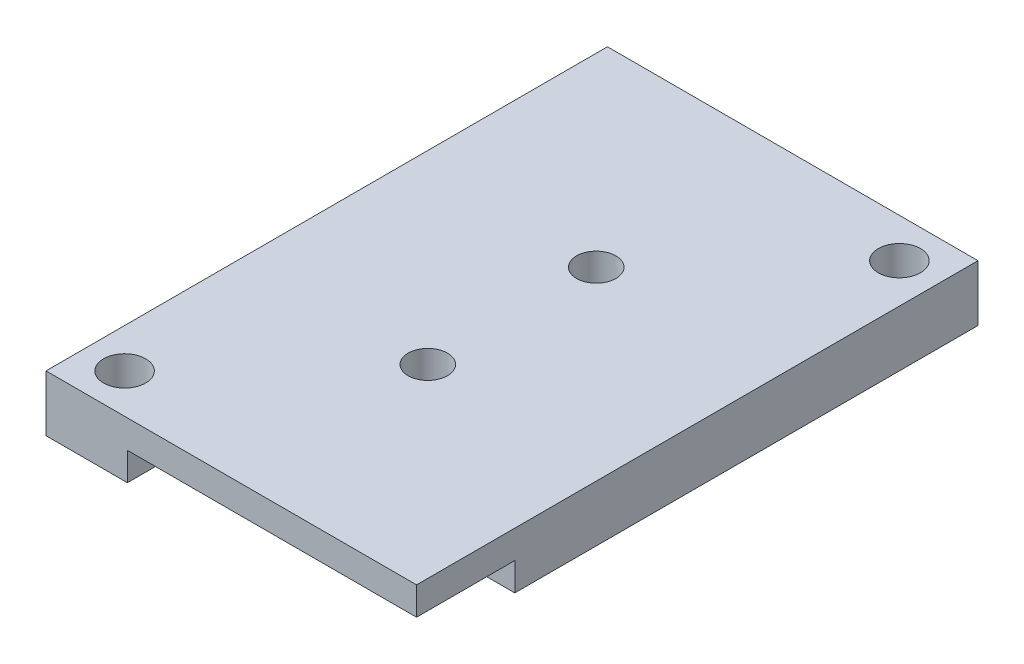
ISO-10303-21;
HEADER;
FILE_DESCRIPTION(('STEP AP214'),'2;1');
FILE_NAME('part.step','',(''),(''),'','','');
FILE_SCHEMA(('AUTOMOTIVE_DESIGN { 1 0 10303 214 1 1 1 1 }'));
ENDSEC;
DATA;
#1=APPLICATION_CONTEXT('core data for automotive mechanical design processes');
#2=APPLICATION_PROTOCOL_DEFINITION('international standard','automotive_design',2000,#1);
#3=PRODUCT_CONTEXT('',#1,'mechanical');
#4=PRODUCT('Part','Part','',(#3));
#5=PRODUCT_RELATED_PRODUCT_CATEGORY('part','',(#4));
#6=PRODUCT_DEFINITION_FORMATION('','',#4);
#7=PRODUCT_DEFINITION_CONTEXT('part definition',#1,'design');
#8=PRODUCT_DEFINITION('design','',#6,#7);
#9=PRODUCT_DEFINITION_SHAPE('','',#8);
#10=(LENGTH_UNIT() NAMED_UNIT(*) SI_UNIT(.MILLI.,.METRE.));
#11=(NAMED_UNIT(*) PLANE_ANGLE_UNIT() SI_UNIT($,.RADIAN.));
#12=(NAMED_UNIT(*) SI_UNIT($,.STERADIAN.) SOLID_ANGLE_UNIT());
#13=UNCERTAINTY_MEASURE_WITH_UNIT(LENGTH_MEASURE(1.E-05),#10,'distance_accuracy_value','');
#14=(GEOMETRIC_REPRESENTATION_CONTEXT(3) GLOBAL_UNCERTAINTY_ASSIGNED_CONTEXT((#13)) GLOBAL_UNIT_ASSIGNED_CONTEXT((#10,
#11,#12)) REPRESENTATION_CONTEXT('',''));
#15=CARTESIAN_POINT('',(0.,0.,0.));
#16=DIRECTION('',(0.,0.,1.));
#17=DIRECTION('',(1.,0.,0.));
#18=AXIS2_PLACEMENT_3D('',#15,#16,#17);
#19=CARTESIAN_POINT('',(0.,0.,0.));
#20=DIRECTION('',(0.,-1.,0.));
#21=DIRECTION('',(0.,0.,-1.));
#22=AXIS2_PLACEMENT_3D('',#19,#20,#21);
#23=PLANE('',#22);
#24=CARTESIAN_POINT('',(5.2,0.,-8.6));
#25=DIRECTION('',(0.,1.,0.));
#26=DIRECTION('',(0.,0.,1.));
#27=AXIS2_PLACEMENT_3D('',#24,#25,#26);
#28=CIRCLE('',#27,0.75);
#29=CARTESIAN_POINT('',(5.2,0.,-7.85));
#30=VERTEX_POINT('',#29);
#31=EDGE_CURVE('E239',#30,#30,#28,.T.);
#32=ORIENTED_EDGE('',*,*,#31,.T.);
#33=EDGE_LOOP('',(#32));
#34=FACE_BOUND('',#33,.T.);
#35=DIRECTION('',(-1.,0.,0.));
#36=VECTOR('',#35,1.);
#37=CARTESIAN_POINT('',(0.,0.,-6.5));
#38=LINE('',#37,#36);
#39=CARTESIAN_POINT('',(3.7,0.,-6.5));
#40=VERTEX_POINT('',#39);
#41=CARTESIAN_POINT('',(2.5,0.,-6.5));
#42=VERTEX_POINT('',#41);
#43=EDGE_CURVE('E195',#40,#42,#38,.T.);
#44=ORIENTED_EDGE('',*,*,#43,.F.);
#45=DIRECTION('',(0.,0.,-1.));
#46=VECTOR('',#45,1.);
#47=CARTESIAN_POINT('',(3.7,0.,0.));
#48=LINE('',#47,#46);
#49=CARTESIAN_POINT('',(3.7,0.,-10.));
#50=VERTEX_POINT('',#49);
#51=EDGE_CURVE('E202',#40,#50,#48,.T.);
#52=ORIENTED_EDGE('',*,*,#51,.T.);
#53=DIRECTION('',(1.,0.,0.));
#54=VECTOR('',#53,1.);
#55=CARTESIAN_POINT('',(-6.6,0.,-10.));
#56=LINE('',#55,#54);
#57=CARTESIAN_POINT('',(6.6,0.,-10.));
#58=VERTEX_POINT('',#57);
#59=EDGE_CURVE('E235',#50,#58,#56,.T.);
#60=ORIENTED_EDGE('',*,*,#59,.T.);
#61=DIRECTION('',(0.,0.,1.));
#62=VECTOR('',#61,1.);
#63=CARTESIAN_POINT('',(6.6,0.,-10.));
#64=LINE('',#63,#62);
#65=CARTESIAN_POINT('',(6.6,0.,6.5));
#66=VERTEX_POINT('',#65);
#67=EDGE_CURVE('E253',#58,#66,#64,.T.);
#68=ORIENTED_EDGE('',*,*,#67,.T.);
#69=DIRECTION('',(1.,0.,0.));
#70=VECTOR('',#69,1.);
#71=CARTESIAN_POINT('',(0.,0.,6.5));
#72=LINE('',#71,#70);
#73=CARTESIAN_POINT('',(2.5,0.,6.5));
#74=VERTEX_POINT('',#73);
#75=EDGE_CURVE('E226',#74,#66,#72,.T.);
#76=ORIENTED_EDGE('',*,*,#75,.F.);
#77=DIRECTION('',(0.,0.,-1.));
#78=VECTOR('',#77,1.);
#79=CARTESIAN_POINT('',(2.5,0.,0.));
#80=LINE('',#79,#78);
#81=EDGE_CURVE('E52',#74,#42,#80,.T.);
#82=ORIENTED_EDGE('',*,*,#81,.T.);
#83=EDGE_LOOP('',(#44,#52,#60,#68,#76,#82));
#84=FACE_BOUND('',#83,.T.);
#85=ADVANCED_FACE('F35',(#34,#84),#23,.T.);
#86=CARTESIAN_POINT('',(-6.6,2.,-10.));
#87=DIRECTION('',(0.,0.,-1.));
#88=DIRECTION('',(-1.,0.,0.));
#89=AXIS2_PLACEMENT_3D('',#86,#87,#88);
#90=PLANE('',#89);
#91=DIRECTION('',(-1.,0.,0.));
#92=VECTOR('',#91,1.);
#93=CARTESIAN_POINT('',(0.,1.,-10.));
#94=LINE('',#93,#92);
#95=CARTESIAN_POINT('',(3.7,1.,-10.));
#96=VERTEX_POINT('',#95);
#97=CARTESIAN_POINT('',(-6.6,1.,-10.));
#98=VERTEX_POINT('',#97);
#99=EDGE_CURVE('E194',#96,#98,#94,.T.);
#100=ORIENTED_EDGE('',*,*,#99,.T.);
#101=DIRECTION('',(0.,-1.,0.));
#102=VECTOR('',#101,1.);
#103=CARTESIAN_POINT('',(-6.6,2.,-10.));
#104=LINE('',#103,#102);
#105=CARTESIAN_POINT('',(-6.6,2.,-10.));
#106=VERTEX_POINT('',#105);
#107=EDGE_CURVE('E11',#106,#98,#104,.T.);
#108=ORIENTED_EDGE('',*,*,#107,.F.);
#109=DIRECTION('',(1.,0.,0.));
#110=VECTOR('',#109,1.);
#111=CARTESIAN_POINT('',(-6.6,2.,-10.));
#112=LINE('',#111,#110);
#113=CARTESIAN_POINT('',(6.6,2.,-10.));
#114=VERTEX_POINT('',#113);
#115=EDGE_CURVE('E244',#106,#114,#112,.T.);
#116=ORIENTED_EDGE('',*,*,#115,.T.);
#117=DIRECTION('',(0.,-1.,0.));
#118=VECTOR('',#117,1.);
#119=CARTESIAN_POINT('',(6.6,2.,-10.));
#120=LINE('',#119,#118);
#121=EDGE_CURVE('E84',#114,#58,#120,.T.);
#122=ORIENTED_EDGE('',*,*,#121,.T.);
#123=ORIENTED_EDGE('',*,*,#59,.F.);
#124=DIRECTION('',(0.,-1.,0.));
#125=VECTOR('',#124,1.);
#126=CARTESIAN_POINT('',(3.7,1.,-10.));
#127=LINE('',#126,#125);
#128=EDGE_CURVE('E185',#96,#50,#127,.T.);
#129=ORIENTED_EDGE('',*,*,#128,.F.);
#130=EDGE_LOOP('',(#100,#108,#116,#122,#123,#129));
#131=FACE_BOUND('',#130,.T.);
#132=ADVANCED_FACE('F37',(#131),#90,.T.);
#133=CARTESIAN_POINT('',(-6.6,2.,-10.));
#134=DIRECTION('',(1.,0.,0.));
#135=DIRECTION('',(0.,0.,-1.));
#136=AXIS2_PLACEMENT_3D('',#133,#134,#135);
#137=PLANE('',#136);
#138=ORIENTED_EDGE('',*,*,#107,.T.);
#139=DIRECTION('',(0.,0.,-1.));
#140=VECTOR('',#139,1.);
#141=CARTESIAN_POINT('',(-6.6,1.,0.));
#142=LINE('',#141,#140);
#143=CARTESIAN_POINT('',(-6.6,1.,-6.5));
#144=VERTEX_POINT('',#143);
#145=EDGE_CURVE('E197',#144,#98,#142,.T.);
#146=ORIENTED_EDGE('',*,*,#145,.F.);
#147=DIRECTION('',(0.,-1.,0.));
#148=VECTOR('',#147,1.);
#149=CARTESIAN_POINT('',(-6.6,1.,-6.5));
#150=LINE('',#149,#148);
#151=CARTESIAN_POINT('',(-6.6,0.,-6.5));
#152=VERTEX_POINT('',#151);
#153=EDGE_CURVE('E210',#144,#152,#150,.T.);
#154=ORIENTED_EDGE('',*,*,#153,.T.);
#155=DIRECTION('',(0.,0.,1.));
#156=VECTOR('',#155,1.);
#157=CARTESIAN_POINT('',(-6.6,0.,-10.));
#158=LINE('',#157,#156);
#159=CARTESIAN_POINT('',(-6.6,0.,10.));
#160=VERTEX_POINT('',#159);
#161=EDGE_CURVE('E76',#152,#160,#158,.T.);
#162=ORIENTED_EDGE('',*,*,#161,.T.);
#163=DIRECTION('',(0.,-1.,0.));
#164=VECTOR('',#163,1.);
#165=CARTESIAN_POINT('',(-6.6,2.,10.));
#166=LINE('',#165,#164);
#167=CARTESIAN_POINT('',(-6.6,2.,10.));
#168=VERTEX_POINT('',#167);
#169=EDGE_CURVE('E44',#168,#160,#166,.T.);
#170=ORIENTED_EDGE('',*,*,#169,.F.);
#171=DIRECTION('',(0.,0.,1.));
#172=VECTOR('',#171,1.);
#173=CARTESIAN_POINT('',(-6.6,2.,-10.));
#174=LINE('',#173,#172);
#175=EDGE_CURVE('E250',#106,#168,#174,.T.);
#176=ORIENTED_EDGE('',*,*,#175,.F.);
#177=EDGE_LOOP('',(#138,#146,#154,#162,#170,#176));
#178=FACE_BOUND('',#177,.T.);
#179=ADVANCED_FACE('F299',(#178),#137,.F.);
#180=CARTESIAN_POINT('',(-6.6,2.,10.));
#181=DIRECTION('',(0.,0.,-1.));
#182=DIRECTION('',(-1.,0.,0.));
#183=AXIS2_PLACEMENT_3D('',#180,#181,#182);
#184=PLANE('',#183);
#185=DIRECTION('',(0.,-1.,0.));
#186=VECTOR('',#185,1.);
#187=CARTESIAN_POINT('',(-3.7,1.,10.));
#188=LINE('',#187,#186);
#189=CARTESIAN_POINT('',(-3.7,1.,10.));
#190=VERTEX_POINT('',#189);
#191=CARTESIAN_POINT('',(-3.7,0.,10.));
#192=VERTEX_POINT('',#191);
#193=EDGE_CURVE('E206',#190,#192,#188,.T.);
#194=ORIENTED_EDGE('',*,*,#193,.F.);
#195=DIRECTION('',(1.,0.,0.));
#196=VECTOR('',#195,1.);
#197=CARTESIAN_POINT('',(0.,1.,10.));
#198=LINE('',#197,#196);
#199=CARTESIAN_POINT('',(6.6,1.,10.));
#200=VERTEX_POINT('',#199);
#201=EDGE_CURVE('E216',#190,#200,#198,.T.);
#202=ORIENTED_EDGE('',*,*,#201,.T.);
#203=DIRECTION('',(0.,-1.,0.));
#204=VECTOR('',#203,1.);
#205=CARTESIAN_POINT('',(6.6,2.,10.));
#206=LINE('',#205,#204);
#207=CARTESIAN_POINT('',(6.6,2.,10.));
#208=VERTEX_POINT('',#207);
#209=EDGE_CURVE('E261',#208,#200,#206,.T.);
#210=ORIENTED_EDGE('',*,*,#209,.F.);
#211=DIRECTION('',(1.,0.,0.));
#212=VECTOR('',#211,1.);
#213=CARTESIAN_POINT('',(-6.6,2.,10.));
#214=LINE('',#213,#212);
#215=EDGE_CURVE('E248',#168,#208,#214,.T.);
#216=ORIENTED_EDGE('',*,*,#215,.F.);
#217=ORIENTED_EDGE('',*,*,#169,.T.);
#218=DIRECTION('',(1.,0.,0.));
#219=VECTOR('',#218,1.);
#220=CARTESIAN_POINT('',(-6.6,0.,10.));
#221=LINE('',#220,#219);
#222=EDGE_CURVE('E256',#160,#192,#221,.T.);
#223=ORIENTED_EDGE('',*,*,#222,.T.);
#224=EDGE_LOOP('',(#194,#202,#210,#216,#217,#223));
#225=FACE_BOUND('',#224,.T.);
#226=ADVANCED_FACE('F305',(#225),#184,.F.);
#227=CARTESIAN_POINT('',(6.6,2.,-10.));
#228=DIRECTION('',(1.,0.,0.));
#229=DIRECTION('',(0.,0.,-1.));
#230=AXIS2_PLACEMENT_3D('',#227,#228,#229);
#231=PLANE('',#230);
#232=DIRECTION('',(0.,0.,1.));
#233=VECTOR('',#232,1.);
#234=CARTESIAN_POINT('',(6.6,1.,0.));
#235=LINE('',#234,#233);
#236=CARTESIAN_POINT('',(6.6,1.,6.5));
#237=VERTEX_POINT('',#236);
#238=EDGE_CURVE('E166',#237,#200,#235,.T.);
#239=ORIENTED_EDGE('',*,*,#238,.F.);
#240=DIRECTION('',(0.,-1.,0.));
#241=VECTOR('',#240,1.);
#242=CARTESIAN_POINT('',(6.6,1.,6.5));
#243=LINE('',#242,#241);
#244=EDGE_CURVE('E162',#237,#66,#243,.T.);
#245=ORIENTED_EDGE('',*,*,#244,.T.);
#246=ORIENTED_EDGE('',*,*,#67,.F.);
#247=ORIENTED_EDGE('',*,*,#121,.F.);
#248=DIRECTION('',(0.,0.,1.));
#249=VECTOR('',#248,1.);
#250=CARTESIAN_POINT('',(6.6,2.,-10.));
#251=LINE('',#250,#249);
#252=EDGE_CURVE('E246',#114,#208,#251,.T.);
#253=ORIENTED_EDGE('',*,*,#252,.T.);
#254=ORIENTED_EDGE('',*,*,#209,.T.);
#255=EDGE_LOOP('',(#239,#245,#246,#247,#253,#254));
#256=FACE_BOUND('',#255,.T.);
#257=ADVANCED_FACE('F283',(#256),#231,.T.);
#258=CARTESIAN_POINT('',(0.,2.,0.));
#259=DIRECTION('',(0.,-1.,0.));
#260=DIRECTION('',(0.,0.,-1.));
#261=AXIS2_PLACEMENT_3D('',#258,#259,#260);
#262=PLANE('',#261);
#263=CARTESIAN_POINT('',(0.,2.,-3.));
#264=DIRECTION('',(0.,1.,0.));
#265=DIRECTION('',(0.,0.,1.));
#266=AXIS2_PLACEMENT_3D('',#263,#264,#265);
#267=CIRCLE('',#266,0.7);
#268=CARTESIAN_POINT('',(0.,2.,-2.3));
#269=VERTEX_POINT('',#268);
#270=EDGE_CURVE('E266',#269,#269,#267,.T.);
#271=ORIENTED_EDGE('',*,*,#270,.F.);
#272=EDGE_LOOP('',(#271));
#273=FACE_BOUND('',#272,.T.);
#274=CARTESIAN_POINT('',(0.,2.,3.));
#275=DIRECTION('',(0.,1.,0.));
#276=DIRECTION('',(0.,0.,1.));
#277=AXIS2_PLACEMENT_3D('',#274,#275,#276);
#278=CIRCLE('',#277,0.7);
#279=CARTESIAN_POINT('',(0.,2.,3.7));
#280=VERTEX_POINT('',#279);
#281=EDGE_CURVE('E182',#280,#280,#278,.T.);
#282=ORIENTED_EDGE('',*,*,#281,.F.);
#283=EDGE_LOOP('',(#282));
#284=FACE_BOUND('',#283,.T.);
#285=CARTESIAN_POINT('',(-5.2,2.,8.6));
#286=DIRECTION('',(0.,1.,0.));
#287=DIRECTION('',(0.,0.,1.));
#288=AXIS2_PLACEMENT_3D('',#285,#286,#287);
#289=CIRCLE('',#288,0.75);
#290=CARTESIAN_POINT('',(-5.2,2.,9.35));
#291=VERTEX_POINT('',#290);
#292=EDGE_CURVE('E232',#291,#291,#289,.T.);
#293=ORIENTED_EDGE('',*,*,#292,.F.);
#294=EDGE_LOOP('',(#293));
#295=FACE_BOUND('',#294,.T.);
#296=CARTESIAN_POINT('',(5.2,2.,-8.6));
#297=DIRECTION('',(0.,1.,0.));
#298=DIRECTION('',(0.,0.,1.));
#299=AXIS2_PLACEMENT_3D('',#296,#297,#298);
#300=CIRCLE('',#299,0.75);
#301=CARTESIAN_POINT('',(5.2,2.,-7.85));
#302=VERTEX_POINT('',#301);
#303=EDGE_CURVE('E155',#302,#302,#300,.T.);
#304=ORIENTED_EDGE('',*,*,#303,.F.);
#305=EDGE_LOOP('',(#304));
#306=FACE_BOUND('',#305,.T.);
#307=ORIENTED_EDGE('',*,*,#115,.F.);
#308=ORIENTED_EDGE('',*,*,#175,.T.);
#309=ORIENTED_EDGE('',*,*,#215,.T.);
#310=ORIENTED_EDGE('',*,*,#252,.F.);
#311=EDGE_LOOP('',(#307,#308,#309,#310));
#312=FACE_BOUND('',#311,.T.);
#313=ADVANCED_FACE('F279',(#273,#284,#295,#306,#312),#262,.F.);
#314=CARTESIAN_POINT('',(-2.5,0.,-6.5));
#315=VERTEX_POINT('',#314);
#316=EDGE_CURVE('E205',#315,#152,#38,.T.);
#317=ORIENTED_EDGE('',*,*,#316,.F.);
#318=DIRECTION('',(0.,0.,-1.));
#319=VECTOR('',#318,1.);
#320=CARTESIAN_POINT('',(-2.5,0.,0.));
#321=LINE('',#320,#319);
#322=CARTESIAN_POINT('',(-2.5,0.,6.5));
#323=VERTEX_POINT('',#322);
#324=EDGE_CURVE('E175',#323,#315,#321,.T.);
#325=ORIENTED_EDGE('',*,*,#324,.F.);
#326=CARTESIAN_POINT('',(-3.7,0.,6.5));
#327=VERTEX_POINT('',#326);
#328=EDGE_CURVE('E217',#327,#323,#72,.T.);
#329=ORIENTED_EDGE('',*,*,#328,.F.);
#330=DIRECTION('',(0.,0.,1.));
#331=VECTOR('',#330,1.);
#332=CARTESIAN_POINT('',(-3.7,0.,0.));
#333=LINE('',#332,#331);
#334=EDGE_CURVE('E223',#327,#192,#333,.T.);
#335=ORIENTED_EDGE('',*,*,#334,.T.);
#336=ORIENTED_EDGE('',*,*,#222,.F.);
#337=ORIENTED_EDGE('',*,*,#161,.F.);
#338=EDGE_LOOP('',(#317,#325,#329,#335,#336,#337));
#339=FACE_BOUND('',#338,.T.);
#340=CARTESIAN_POINT('',(-5.2,0.,8.6));
#341=DIRECTION('',(0.,1.,0.));
#342=DIRECTION('',(0.,0.,1.));
#343=AXIS2_PLACEMENT_3D('',#340,#341,#342);
#344=CIRCLE('',#343,0.75);
#345=CARTESIAN_POINT('',(-5.2,0.,9.35));
#346=VERTEX_POINT('',#345);
#347=EDGE_CURVE('E236',#346,#346,#344,.T.);
#348=ORIENTED_EDGE('',*,*,#347,.T.);
#349=EDGE_LOOP('',(#348));
#350=FACE_BOUND('',#349,.T.);
#351=ADVANCED_FACE('F282',(#339,#350),#23,.T.);
#352=CARTESIAN_POINT('',(5.2,2.,-8.6));
#353=DIRECTION('',(0.,-1.,0.));
#354=DIRECTION('',(0.,0.,-1.));
#355=AXIS2_PLACEMENT_3D('',#352,#353,#354);
#356=CYLINDRICAL_SURFACE('',#355,0.75);
#357=ORIENTED_EDGE('',*,*,#303,.T.);
#358=EDGE_LOOP('',(#357));
#359=FACE_BOUND('',#358,.T.);
#360=ORIENTED_EDGE('',*,*,#31,.F.);
#361=EDGE_LOOP('',(#360));
#362=FACE_BOUND('',#361,.T.);
#363=ADVANCED_FACE('F339',(#359,#362),#356,.F.);
#364=CARTESIAN_POINT('',(-5.2,2.,8.6));
#365=DIRECTION('',(0.,-1.,0.));
#366=DIRECTION('',(0.,0.,-1.));
#367=AXIS2_PLACEMENT_3D('',#364,#365,#366);
#368=CYLINDRICAL_SURFACE('',#367,0.75);
#369=ORIENTED_EDGE('',*,*,#292,.T.);
#370=EDGE_LOOP('',(#369));
#371=FACE_BOUND('',#370,.T.);
#372=ORIENTED_EDGE('',*,*,#347,.F.);
#373=EDGE_LOOP('',(#372));
#374=FACE_BOUND('',#373,.T.);
#375=ADVANCED_FACE('F328',(#371,#374),#368,.F.);
#376=CARTESIAN_POINT('',(0.,1.,0.));
#377=DIRECTION('',(0.,1.,0.));
#378=DIRECTION('',(0.,0.,1.));
#379=AXIS2_PLACEMENT_3D('',#376,#377,#378);
#380=PLANE('',#379);
#381=CARTESIAN_POINT('',(0.,1.,-3.));
#382=DIRECTION('',(0.,1.,0.));
#383=DIRECTION('',(0.,0.,1.));
#384=AXIS2_PLACEMENT_3D('',#381,#382,#383);
#385=CIRCLE('',#384,0.7);
#386=CARTESIAN_POINT('',(0.,1.,-2.3));
#387=VERTEX_POINT('',#386);
#388=EDGE_CURVE('E39',#387,#387,#385,.T.);
#389=ORIENTED_EDGE('',*,*,#388,.T.);
#390=EDGE_LOOP('',(#389));
#391=FACE_BOUND('',#390,.T.);
#392=CARTESIAN_POINT('',(0.,1.,3.));
#393=DIRECTION('',(0.,1.,0.));
#394=DIRECTION('',(0.,0.,1.));
#395=AXIS2_PLACEMENT_3D('',#392,#393,#394);
#396=CIRCLE('',#395,0.7);
#397=CARTESIAN_POINT('',(0.,1.,3.7));
#398=VERTEX_POINT('',#397);
#399=EDGE_CURVE('E264',#398,#398,#396,.T.);
#400=ORIENTED_EDGE('',*,*,#399,.T.);
#401=EDGE_LOOP('',(#400));
#402=FACE_BOUND('',#401,.T.);
#403=DIRECTION('',(0.,0.,-1.));
#404=VECTOR('',#403,1.);
#405=CARTESIAN_POINT('',(-2.5,1.,0.));
#406=LINE('',#405,#404);
#407=CARTESIAN_POINT('',(-2.5,1.,6.5));
#408=VERTEX_POINT('',#407);
#409=CARTESIAN_POINT('',(-2.5,1.,-6.5));
#410=VERTEX_POINT('',#409);
#411=EDGE_CURVE('E174',#408,#410,#406,.T.);
#412=ORIENTED_EDGE('',*,*,#411,.T.);
#413=DIRECTION('',(-1.,0.,0.));
#414=VECTOR('',#413,1.);
#415=CARTESIAN_POINT('',(0.,1.,-6.5));
#416=LINE('',#415,#414);
#417=EDGE_CURVE('E199',#410,#144,#416,.T.);
#418=ORIENTED_EDGE('',*,*,#417,.T.);
#419=ORIENTED_EDGE('',*,*,#145,.T.);
#420=ORIENTED_EDGE('',*,*,#99,.F.);
#421=DIRECTION('',(0.,0.,-1.));
#422=VECTOR('',#421,1.);
#423=CARTESIAN_POINT('',(3.7,1.,0.));
#424=LINE('',#423,#422);
#425=CARTESIAN_POINT('',(3.7,1.,-6.5));
#426=VERTEX_POINT('',#425);
#427=EDGE_CURVE('E191',#426,#96,#424,.T.);
#428=ORIENTED_EDGE('',*,*,#427,.F.);
#429=CARTESIAN_POINT('',(2.5,1.,-6.5));
#430=VERTEX_POINT('',#429);
#431=EDGE_CURVE('E173',#426,#430,#416,.T.);
#432=ORIENTED_EDGE('',*,*,#431,.T.);
#433=DIRECTION('',(0.,0.,-1.));
#434=VECTOR('',#433,1.);
#435=CARTESIAN_POINT('',(2.5,1.,0.));
#436=LINE('',#435,#434);
#437=CARTESIAN_POINT('',(2.5,1.,6.5));
#438=VERTEX_POINT('',#437);
#439=EDGE_CURVE('E152',#438,#430,#436,.T.);
#440=ORIENTED_EDGE('',*,*,#439,.F.);
#441=DIRECTION('',(1.,0.,0.));
#442=VECTOR('',#441,1.);
#443=CARTESIAN_POINT('',(0.,1.,6.5));
#444=LINE('',#443,#442);
#445=EDGE_CURVE('E159',#438,#237,#444,.T.);
#446=ORIENTED_EDGE('',*,*,#445,.T.);
#447=ORIENTED_EDGE('',*,*,#238,.T.);
#448=ORIENTED_EDGE('',*,*,#201,.F.);
#449=DIRECTION('',(0.,0.,1.));
#450=VECTOR('',#449,1.);
#451=CARTESIAN_POINT('',(-3.7,1.,0.));
#452=LINE('',#451,#450);
#453=CARTESIAN_POINT('',(-3.7,1.,6.5));
#454=VERTEX_POINT('',#453);
#455=EDGE_CURVE('E213',#454,#190,#452,.T.);
#456=ORIENTED_EDGE('',*,*,#455,.F.);
#457=EDGE_CURVE('E165',#454,#408,#444,.T.);
#458=ORIENTED_EDGE('',*,*,#457,.T.);
#459=EDGE_LOOP('',(#412,#418,#419,#420,#428,#432,#440,#446,#447,#448,#456,#458));
#460=FACE_BOUND('',#459,.T.);
#461=ADVANCED_FACE('F170',(#391,#402,#460),#380,.F.);
#462=CARTESIAN_POINT('',(2.5,1.,0.));
#463=DIRECTION('',(-1.,0.,0.));
#464=DIRECTION('',(0.,0.,1.));
#465=AXIS2_PLACEMENT_3D('',#462,#463,#464);
#466=PLANE('',#465);
#467=ORIENTED_EDGE('',*,*,#81,.F.);
#468=DIRECTION('',(0.,-1.,0.));
#469=VECTOR('',#468,1.);
#470=CARTESIAN_POINT('',(2.5,1.,6.5));
#471=LINE('',#470,#469);
#472=EDGE_CURVE('E148',#438,#74,#471,.T.);
#473=ORIENTED_EDGE('',*,*,#472,.F.);
#474=ORIENTED_EDGE('',*,*,#439,.T.);
#475=DIRECTION('',(0.,-1.,0.));
#476=VECTOR('',#475,1.);
#477=CARTESIAN_POINT('',(2.5,1.,-6.5));
#478=LINE('',#477,#476);
#479=EDGE_CURVE('E156',#430,#42,#478,.T.);
#480=ORIENTED_EDGE('',*,*,#479,.T.);
#481=EDGE_LOOP('',(#467,#473,#474,#480));
#482=FACE_BOUND('',#481,.T.);
#483=ADVANCED_FACE('F150',(#482),#466,.T.);
#484=CARTESIAN_POINT('',(-2.5,1.,0.));
#485=DIRECTION('',(-1.,0.,0.));
#486=DIRECTION('',(0.,0.,1.));
#487=AXIS2_PLACEMENT_3D('',#484,#485,#486);
#488=PLANE('',#487);
#489=ORIENTED_EDGE('',*,*,#324,.T.);
#490=DIRECTION('',(0.,-1.,0.));
#491=VECTOR('',#490,1.);
#492=CARTESIAN_POINT('',(-2.5,1.,-6.5));
#493=LINE('',#492,#491);
#494=EDGE_CURVE('E188',#410,#315,#493,.T.);
#495=ORIENTED_EDGE('',*,*,#494,.F.);
#496=ORIENTED_EDGE('',*,*,#411,.F.);
#497=DIRECTION('',(0.,-1.,0.));
#498=VECTOR('',#497,1.);
#499=CARTESIAN_POINT('',(-2.5,1.,6.5));
#500=LINE('',#499,#498);
#501=EDGE_CURVE('E177',#408,#323,#500,.T.);
#502=ORIENTED_EDGE('',*,*,#501,.T.);
#503=EDGE_LOOP('',(#489,#495,#496,#502));
#504=FACE_BOUND('',#503,.T.);
#505=ADVANCED_FACE('F320',(#504),#488,.F.);
#506=CARTESIAN_POINT('',(3.7,1.,0.));
#507=DIRECTION('',(-1.,0.,0.));
#508=DIRECTION('',(0.,0.,1.));
#509=AXIS2_PLACEMENT_3D('',#506,#507,#508);
#510=PLANE('',#509);
#511=ORIENTED_EDGE('',*,*,#51,.F.);
#512=DIRECTION('',(0.,-1.,0.));
#513=VECTOR('',#512,1.);
#514=CARTESIAN_POINT('',(3.7,1.,-6.5));
#515=LINE('',#514,#513);
#516=EDGE_CURVE('E201',#426,#40,#515,.T.);
#517=ORIENTED_EDGE('',*,*,#516,.F.);
#518=ORIENTED_EDGE('',*,*,#427,.T.);
#519=ORIENTED_EDGE('',*,*,#128,.T.);
#520=EDGE_LOOP('',(#511,#517,#518,#519));
#521=FACE_BOUND('',#520,.T.);
#522=ADVANCED_FACE('F297',(#521),#510,.T.);
#523=CARTESIAN_POINT('',(0.,1.,-6.5));
#524=DIRECTION('',(0.,0.,1.));
#525=DIRECTION('',(1.,0.,0.));
#526=AXIS2_PLACEMENT_3D('',#523,#524,#525);
#527=PLANE('',#526);
#528=ORIENTED_EDGE('',*,*,#431,.F.);
#529=ORIENTED_EDGE('',*,*,#516,.T.);
#530=ORIENTED_EDGE('',*,*,#43,.T.);
#531=ORIENTED_EDGE('',*,*,#479,.F.);
#532=EDGE_LOOP('',(#528,#529,#530,#531));
#533=FACE_BOUND('',#532,.T.);
#534=ADVANCED_FACE('F326',(#533),#527,.F.);
#535=ORIENTED_EDGE('',*,*,#494,.T.);
#536=ORIENTED_EDGE('',*,*,#316,.T.);
#537=ORIENTED_EDGE('',*,*,#153,.F.);
#538=ORIENTED_EDGE('',*,*,#417,.F.);
#539=EDGE_LOOP('',(#535,#536,#537,#538));
#540=FACE_BOUND('',#539,.T.);
#541=ADVANCED_FACE('F324',(#540),#527,.F.);
#542=CARTESIAN_POINT('',(-3.7,1.,0.));
#543=DIRECTION('',(1.,0.,0.));
#544=DIRECTION('',(0.,0.,-1.));
#545=AXIS2_PLACEMENT_3D('',#542,#543,#544);
#546=PLANE('',#545);
#547=ORIENTED_EDGE('',*,*,#334,.F.);
#548=DIRECTION('',(0.,-1.,0.));
#549=VECTOR('',#548,1.);
#550=CARTESIAN_POINT('',(-3.7,1.,6.5));
#551=LINE('',#550,#549);
#552=EDGE_CURVE('E222',#454,#327,#551,.T.);
#553=ORIENTED_EDGE('',*,*,#552,.F.);
#554=ORIENTED_EDGE('',*,*,#455,.T.);
#555=ORIENTED_EDGE('',*,*,#193,.T.);
#556=EDGE_LOOP('',(#547,#553,#554,#555));
#557=FACE_BOUND('',#556,.T.);
#558=ADVANCED_FACE('F310',(#557),#546,.T.);
#559=CARTESIAN_POINT('',(0.,1.,6.5));
#560=DIRECTION('',(0.,0.,-1.));
#561=DIRECTION('',(-1.,0.,0.));
#562=AXIS2_PLACEMENT_3D('',#559,#560,#561);
#563=PLANE('',#562);
#564=ORIENTED_EDGE('',*,*,#457,.F.);
#565=ORIENTED_EDGE('',*,*,#552,.T.);
#566=ORIENTED_EDGE('',*,*,#328,.T.);
#567=ORIENTED_EDGE('',*,*,#501,.F.);
#568=EDGE_LOOP('',(#564,#565,#566,#567));
#569=FACE_BOUND('',#568,.T.);
#570=ADVANCED_FACE('F317',(#569),#563,.F.);
#571=ORIENTED_EDGE('',*,*,#472,.T.);
#572=ORIENTED_EDGE('',*,*,#75,.T.);
#573=ORIENTED_EDGE('',*,*,#244,.F.);
#574=ORIENTED_EDGE('',*,*,#445,.F.);
#575=EDGE_LOOP('',(#571,#572,#573,#574));
#576=FACE_BOUND('',#575,.T.);
#577=ADVANCED_FACE('F160',(#576),#563,.F.);
#578=CARTESIAN_POINT('',(0.,0.,3.));
#579=DIRECTION('',(0.,1.,0.));
#580=DIRECTION('',(0.,0.,1.));
#581=AXIS2_PLACEMENT_3D('',#578,#579,#580);
#582=CYLINDRICAL_SURFACE('',#581,0.7);
#583=ORIENTED_EDGE('',*,*,#281,.T.);
#584=EDGE_LOOP('',(#583));
#585=FACE_BOUND('',#584,.T.);
#586=ORIENTED_EDGE('',*,*,#399,.F.);
#587=EDGE_LOOP('',(#586));
#588=FACE_BOUND('',#587,.T.);
#589=ADVANCED_FACE('F276',(#585,#588),#582,.F.);
#590=CARTESIAN_POINT('',(0.,0.,-3.));
#591=DIRECTION('',(0.,1.,0.));
#592=DIRECTION('',(0.,0.,1.));
#593=AXIS2_PLACEMENT_3D('',#590,#591,#592);
#594=CYLINDRICAL_SURFACE('',#593,0.7);
#595=ORIENTED_EDGE('',*,*,#270,.T.);
#596=EDGE_LOOP('',(#595));
#597=FACE_BOUND('',#596,.T.);
#598=ORIENTED_EDGE('',*,*,#388,.F.);
#599=EDGE_LOOP('',(#598));
#600=FACE_BOUND('',#599,.T.);
#601=ADVANCED_FACE('F364',(#597,#600),#594,.F.);
#602=CLOSED_SHELL('',(#85,#132,#179,#226,#257,#313,#351,#363,#375,#461,#483,#505,#522,#534,#541,
#558,#570,#577,#589,#601));
#603=MANIFOLD_SOLID_BREP('B2',#602);
#604=ADVANCED_BREP_SHAPE_REPRESENTATION('',(#18,#603),#14);
#605=SHAPE_DEFINITION_REPRESENTATION(#9,#604);
ENDSEC;
END-ISO-10303-21;
